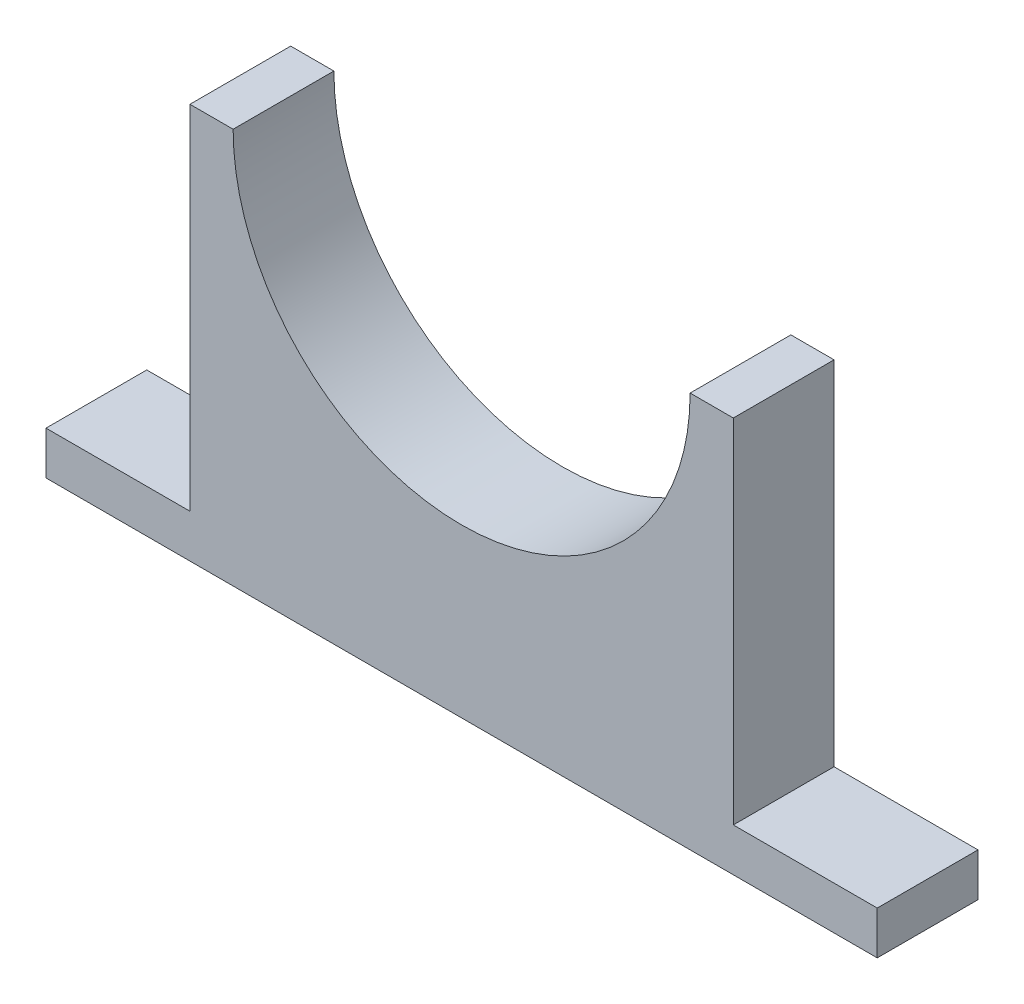
ISO-10303-21;
HEADER;
FILE_DESCRIPTION(('STEP AP214'),'2;1');
FILE_NAME('part.step','',(''),(''),'','','');
FILE_SCHEMA(('AUTOMOTIVE_DESIGN { 1 0 10303 214 1 1 1 1 }'));
ENDSEC;
DATA;
#1=APPLICATION_CONTEXT('core data for automotive mechanical design processes');
#2=APPLICATION_PROTOCOL_DEFINITION('international standard','automotive_design',2000,#1);
#3=PRODUCT_CONTEXT('',#1,'mechanical');
#4=PRODUCT('Part','Part','',(#3));
#5=PRODUCT_RELATED_PRODUCT_CATEGORY('part','',(#4));
#6=PRODUCT_DEFINITION_FORMATION('','',#4);
#7=PRODUCT_DEFINITION_CONTEXT('part definition',#1,'design');
#8=PRODUCT_DEFINITION('design','',#6,#7);
#9=PRODUCT_DEFINITION_SHAPE('','',#8);
#10=(LENGTH_UNIT() NAMED_UNIT(*) SI_UNIT(.MILLI.,.METRE.));
#11=(NAMED_UNIT(*) PLANE_ANGLE_UNIT() SI_UNIT($,.RADIAN.));
#12=(NAMED_UNIT(*) SI_UNIT($,.STERADIAN.) SOLID_ANGLE_UNIT());
#13=UNCERTAINTY_MEASURE_WITH_UNIT(LENGTH_MEASURE(1.E-05),#10,'distance_accuracy_value','');
#14=(GEOMETRIC_REPRESENTATION_CONTEXT(3) GLOBAL_UNCERTAINTY_ASSIGNED_CONTEXT((#13)) GLOBAL_UNIT_ASSIGNED_CONTEXT((#10,
#11,#12)) REPRESENTATION_CONTEXT('',''));
#15=CARTESIAN_POINT('',(0.,0.,0.));
#16=DIRECTION('',(0.,0.,1.));
#17=DIRECTION('',(1.,0.,0.));
#18=AXIS2_PLACEMENT_3D('',#15,#16,#17);
#19=CARTESIAN_POINT('',(0.,0.,7.));
#20=DIRECTION('',(0.,0.,-1.));
#21=DIRECTION('',(-1.,0.,0.));
#22=AXIS2_PLACEMENT_3D('',#19,#20,#21);
#23=CYLINDRICAL_SURFACE('',#22,15.875);
#24=CARTESIAN_POINT('',(0.,0.,0.));
#25=DIRECTION('',(0.,0.,-1.));
#26=DIRECTION('',(1.,0.,0.));
#27=AXIS2_PLACEMENT_3D('',#24,#25,#26);
#28=CIRCLE('',#27,15.875);
#29=CARTESIAN_POINT('',(15.875,0.,0.));
#30=VERTEX_POINT('',#29);
#31=CARTESIAN_POINT('',(-15.875,0.,0.));
#32=VERTEX_POINT('',#31);
#33=EDGE_CURVE('E141',#30,#32,#28,.T.);
#34=ORIENTED_EDGE('',*,*,#33,.T.);
#35=DIRECTION('',(0.,0.,-1.));
#36=VECTOR('',#35,1.);
#37=CARTESIAN_POINT('',(-15.875,0.,7.));
#38=LINE('',#37,#36);
#39=CARTESIAN_POINT('',(-15.875,0.,7.));
#40=VERTEX_POINT('',#39);
#41=EDGE_CURVE('E11',#40,#32,#38,.T.);
#42=ORIENTED_EDGE('',*,*,#41,.F.);
#43=CARTESIAN_POINT('',(0.,0.,7.));
#44=DIRECTION('',(0.,0.,-1.));
#45=DIRECTION('',(1.,0.,0.));
#46=AXIS2_PLACEMENT_3D('',#43,#44,#45);
#47=CIRCLE('',#46,15.875);
#48=CARTESIAN_POINT('',(15.875,0.,7.));
#49=VERTEX_POINT('',#48);
#50=EDGE_CURVE('E159',#49,#40,#47,.T.);
#51=ORIENTED_EDGE('',*,*,#50,.F.);
#52=DIRECTION('',(0.,0.,-1.));
#53=VECTOR('',#52,1.);
#54=CARTESIAN_POINT('',(15.875,0.,7.));
#55=LINE('',#54,#53);
#56=EDGE_CURVE('E137',#49,#30,#55,.T.);
#57=ORIENTED_EDGE('',*,*,#56,.T.);
#58=EDGE_LOOP('',(#34,#42,#51,#57));
#59=FACE_BOUND('',#58,.T.);
#60=ADVANCED_FACE('F33',(#59),#23,.F.);
#61=CARTESIAN_POINT('',(-15.875,0.,7.));
#62=DIRECTION('',(0.,-1.,0.));
#63=DIRECTION('',(1.,0.,0.));
#64=AXIS2_PLACEMENT_3D('',#61,#62,#63);
#65=PLANE('',#64);
#66=DIRECTION('',(-1.,0.,0.));
#67=VECTOR('',#66,1.);
#68=CARTESIAN_POINT('',(-15.875,0.,0.));
#69=LINE('',#68,#67);
#70=CARTESIAN_POINT('',(-18.875,0.,0.));
#71=VERTEX_POINT('',#70);
#72=EDGE_CURVE('E144',#32,#71,#69,.T.);
#73=ORIENTED_EDGE('',*,*,#72,.T.);
#74=DIRECTION('',(0.,0.,-1.));
#75=VECTOR('',#74,1.);
#76=CARTESIAN_POINT('',(-18.875,0.,7.));
#77=LINE('',#76,#75);
#78=CARTESIAN_POINT('',(-18.875,0.,7.));
#79=VERTEX_POINT('',#78);
#80=EDGE_CURVE('E41',#79,#71,#77,.T.);
#81=ORIENTED_EDGE('',*,*,#80,.F.);
#82=DIRECTION('',(-1.,0.,0.));
#83=VECTOR('',#82,1.);
#84=CARTESIAN_POINT('',(-15.875,0.,7.));
#85=LINE('',#84,#83);
#86=EDGE_CURVE('E98',#40,#79,#85,.T.);
#87=ORIENTED_EDGE('',*,*,#86,.F.);
#88=ORIENTED_EDGE('',*,*,#41,.T.);
#89=EDGE_LOOP('',(#73,#81,#87,#88));
#90=FACE_BOUND('',#89,.T.);
#91=ADVANCED_FACE('F208',(#90),#65,.F.);
#92=CARTESIAN_POINT('',(-18.875,0.,7.));
#93=DIRECTION('',(1.,0.,0.));
#94=DIRECTION('',(0.,1.,0.));
#95=AXIS2_PLACEMENT_3D('',#92,#93,#94);
#96=PLANE('',#95);
#97=DIRECTION('',(0.,-1.,0.));
#98=VECTOR('',#97,1.);
#99=CARTESIAN_POINT('',(-18.875,0.,0.));
#100=LINE('',#99,#98);
#101=CARTESIAN_POINT('',(-18.875,-24.485,0.));
#102=VERTEX_POINT('',#101);
#103=EDGE_CURVE('E146',#71,#102,#100,.T.);
#104=ORIENTED_EDGE('',*,*,#103,.T.);
#105=DIRECTION('',(0.,0.,-1.));
#106=VECTOR('',#105,1.);
#107=CARTESIAN_POINT('',(-18.875,-24.485,7.));
#108=LINE('',#107,#106);
#109=CARTESIAN_POINT('',(-18.875,-24.485,7.));
#110=VERTEX_POINT('',#109);
#111=EDGE_CURVE('E172',#110,#102,#108,.T.);
#112=ORIENTED_EDGE('',*,*,#111,.F.);
#113=DIRECTION('',(0.,-1.,0.));
#114=VECTOR('',#113,1.);
#115=CARTESIAN_POINT('',(-18.875,0.,7.));
#116=LINE('',#115,#114);
#117=EDGE_CURVE('E180',#79,#110,#116,.T.);
#118=ORIENTED_EDGE('',*,*,#117,.F.);
#119=ORIENTED_EDGE('',*,*,#80,.T.);
#120=EDGE_LOOP('',(#104,#112,#118,#119));
#121=FACE_BOUND('',#120,.T.);
#122=ADVANCED_FACE('F178',(#121),#96,.F.);
#123=CARTESIAN_POINT('',(-18.875,-24.485,7.));
#124=DIRECTION('',(0.,-1.,0.));
#125=DIRECTION('',(0.,0.,-1.));
#126=AXIS2_PLACEMENT_3D('',#123,#124,#125);
#127=PLANE('',#126);
#128=DIRECTION('',(-1.,0.,0.));
#129=VECTOR('',#128,1.);
#130=CARTESIAN_POINT('',(-18.875,-24.485,0.));
#131=LINE('',#130,#129);
#132=CARTESIAN_POINT('',(-28.875,-24.485,0.));
#133=VERTEX_POINT('',#132);
#134=EDGE_CURVE('E148',#102,#133,#131,.T.);
#135=ORIENTED_EDGE('',*,*,#134,.T.);
#136=DIRECTION('',(0.,0.,-1.));
#137=VECTOR('',#136,1.);
#138=CARTESIAN_POINT('',(-28.875,-24.485,7.));
#139=LINE('',#138,#137);
#140=CARTESIAN_POINT('',(-28.875,-24.485,7.));
#141=VERTEX_POINT('',#140);
#142=EDGE_CURVE('E169',#141,#133,#139,.T.);
#143=ORIENTED_EDGE('',*,*,#142,.F.);
#144=DIRECTION('',(-1.,0.,0.));
#145=VECTOR('',#144,1.);
#146=CARTESIAN_POINT('',(-18.875,-24.485,7.));
#147=LINE('',#146,#145);
#148=EDGE_CURVE('E198',#110,#141,#147,.T.);
#149=ORIENTED_EDGE('',*,*,#148,.F.);
#150=ORIENTED_EDGE('',*,*,#111,.T.);
#151=EDGE_LOOP('',(#135,#143,#149,#150));
#152=FACE_BOUND('',#151,.T.);
#153=ADVANCED_FACE('F189',(#152),#127,.F.);
#154=CARTESIAN_POINT('',(-28.875,-24.485,7.));
#155=DIRECTION('',(1.,0.,0.));
#156=DIRECTION('',(0.,0.,-1.));
#157=AXIS2_PLACEMENT_3D('',#154,#155,#156);
#158=PLANE('',#157);
#159=DIRECTION('',(0.,-1.,0.));
#160=VECTOR('',#159,1.);
#161=CARTESIAN_POINT('',(-28.875,-24.485,0.));
#162=LINE('',#161,#160);
#163=CARTESIAN_POINT('',(-28.875,-27.485,0.));
#164=VERTEX_POINT('',#163);
#165=EDGE_CURVE('E150',#133,#164,#162,.T.);
#166=ORIENTED_EDGE('',*,*,#165,.T.);
#167=DIRECTION('',(0.,0.,-1.));
#168=VECTOR('',#167,1.);
#169=CARTESIAN_POINT('',(-28.875,-27.485,7.));
#170=LINE('',#169,#168);
#171=CARTESIAN_POINT('',(-28.875,-27.485,7.));
#172=VERTEX_POINT('',#171);
#173=EDGE_CURVE('E166',#172,#164,#170,.T.);
#174=ORIENTED_EDGE('',*,*,#173,.F.);
#175=DIRECTION('',(0.,-1.,0.));
#176=VECTOR('',#175,1.);
#177=CARTESIAN_POINT('',(-28.875,-24.485,7.));
#178=LINE('',#177,#176);
#179=EDGE_CURVE('E195',#141,#172,#178,.T.);
#180=ORIENTED_EDGE('',*,*,#179,.F.);
#181=ORIENTED_EDGE('',*,*,#142,.T.);
#182=EDGE_LOOP('',(#166,#174,#180,#181));
#183=FACE_BOUND('',#182,.T.);
#184=ADVANCED_FACE('F193',(#183),#158,.F.);
#185=CARTESIAN_POINT('',(-28.875,-27.485,7.));
#186=DIRECTION('',(0.,1.,0.));
#187=DIRECTION('',(0.,0.,1.));
#188=AXIS2_PLACEMENT_3D('',#185,#186,#187);
#189=PLANE('',#188);
#190=DIRECTION('',(1.,0.,0.));
#191=VECTOR('',#190,1.);
#192=CARTESIAN_POINT('',(-28.875,-27.485,0.));
#193=LINE('',#192,#191);
#194=CARTESIAN_POINT('',(28.875,-27.485,0.));
#195=VERTEX_POINT('',#194);
#196=EDGE_CURVE('E152',#164,#195,#193,.T.);
#197=ORIENTED_EDGE('',*,*,#196,.T.);
#198=DIRECTION('',(0.,0.,-1.));
#199=VECTOR('',#198,1.);
#200=CARTESIAN_POINT('',(28.875,-27.485,7.));
#201=LINE('',#200,#199);
#202=CARTESIAN_POINT('',(28.875,-27.485,7.));
#203=VERTEX_POINT('',#202);
#204=EDGE_CURVE('E163',#203,#195,#201,.T.);
#205=ORIENTED_EDGE('',*,*,#204,.F.);
#206=DIRECTION('',(1.,0.,0.));
#207=VECTOR('',#206,1.);
#208=CARTESIAN_POINT('',(-28.875,-27.485,7.));
#209=LINE('',#208,#207);
#210=EDGE_CURVE('E197',#172,#203,#209,.T.);
#211=ORIENTED_EDGE('',*,*,#210,.F.);
#212=ORIENTED_EDGE('',*,*,#173,.T.);
#213=EDGE_LOOP('',(#197,#205,#211,#212));
#214=FACE_BOUND('',#213,.T.);
#215=ADVANCED_FACE('F220',(#214),#189,.F.);
#216=CARTESIAN_POINT('',(28.875,-27.485,7.));
#217=DIRECTION('',(-1.,0.,0.));
#218=DIRECTION('',(0.,0.,1.));
#219=AXIS2_PLACEMENT_3D('',#216,#217,#218);
#220=PLANE('',#219);
#221=DIRECTION('',(0.,1.,0.));
#222=VECTOR('',#221,1.);
#223=CARTESIAN_POINT('',(28.875,-27.485,0.));
#224=LINE('',#223,#222);
#225=CARTESIAN_POINT('',(28.875,-24.485,0.));
#226=VERTEX_POINT('',#225);
#227=EDGE_CURVE('E154',#195,#226,#224,.T.);
#228=ORIENTED_EDGE('',*,*,#227,.T.);
#229=DIRECTION('',(0.,0.,-1.));
#230=VECTOR('',#229,1.);
#231=CARTESIAN_POINT('',(28.875,-24.485,7.));
#232=LINE('',#231,#230);
#233=CARTESIAN_POINT('',(28.875,-24.485,7.));
#234=VERTEX_POINT('',#233);
#235=EDGE_CURVE('E132',#234,#226,#232,.T.);
#236=ORIENTED_EDGE('',*,*,#235,.F.);
#237=DIRECTION('',(0.,1.,0.));
#238=VECTOR('',#237,1.);
#239=CARTESIAN_POINT('',(28.875,-27.485,7.));
#240=LINE('',#239,#238);
#241=EDGE_CURVE('E123',#203,#234,#240,.T.);
#242=ORIENTED_EDGE('',*,*,#241,.F.);
#243=ORIENTED_EDGE('',*,*,#204,.T.);
#244=EDGE_LOOP('',(#228,#236,#242,#243));
#245=FACE_BOUND('',#244,.T.);
#246=ADVANCED_FACE('F223',(#245),#220,.F.);
#247=CARTESIAN_POINT('',(28.875,-24.485,7.));
#248=DIRECTION('',(0.,-1.,0.));
#249=DIRECTION('',(0.,0.,-1.));
#250=AXIS2_PLACEMENT_3D('',#247,#248,#249);
#251=PLANE('',#250);
#252=DIRECTION('',(-1.,0.,0.));
#253=VECTOR('',#252,1.);
#254=CARTESIAN_POINT('',(28.875,-24.485,0.));
#255=LINE('',#254,#253);
#256=CARTESIAN_POINT('',(18.875,-24.485,0.));
#257=VERTEX_POINT('',#256);
#258=EDGE_CURVE('E131',#226,#257,#255,.T.);
#259=ORIENTED_EDGE('',*,*,#258,.T.);
#260=DIRECTION('',(0.,0.,-1.));
#261=VECTOR('',#260,1.);
#262=CARTESIAN_POINT('',(18.875,-24.485,7.));
#263=LINE('',#262,#261);
#264=CARTESIAN_POINT('',(18.875,-24.485,7.));
#265=VERTEX_POINT('',#264);
#266=EDGE_CURVE('E128',#265,#257,#263,.T.);
#267=ORIENTED_EDGE('',*,*,#266,.F.);
#268=DIRECTION('',(-1.,0.,0.));
#269=VECTOR('',#268,1.);
#270=CARTESIAN_POINT('',(28.875,-24.485,7.));
#271=LINE('',#270,#269);
#272=EDGE_CURVE('E117',#234,#265,#271,.T.);
#273=ORIENTED_EDGE('',*,*,#272,.F.);
#274=ORIENTED_EDGE('',*,*,#235,.T.);
#275=EDGE_LOOP('',(#259,#267,#273,#274));
#276=FACE_BOUND('',#275,.T.);
#277=ADVANCED_FACE('F129',(#276),#251,.F.);
#278=CARTESIAN_POINT('',(18.875,-24.485,7.));
#279=DIRECTION('',(-1.,0.,0.));
#280=DIRECTION('',(0.,-1.,0.));
#281=AXIS2_PLACEMENT_3D('',#278,#279,#280);
#282=PLANE('',#281);
#283=DIRECTION('',(0.,1.,0.));
#284=VECTOR('',#283,1.);
#285=CARTESIAN_POINT('',(18.875,-24.485,0.));
#286=LINE('',#285,#284);
#287=CARTESIAN_POINT('',(18.875,0.,0.));
#288=VERTEX_POINT('',#287);
#289=EDGE_CURVE('E84',#257,#288,#286,.T.);
#290=ORIENTED_EDGE('',*,*,#289,.T.);
#291=DIRECTION('',(0.,0.,-1.));
#292=VECTOR('',#291,1.);
#293=CARTESIAN_POINT('',(18.875,0.,7.));
#294=LINE('',#293,#292);
#295=CARTESIAN_POINT('',(18.875,0.,7.));
#296=VERTEX_POINT('',#295);
#297=EDGE_CURVE('E133',#296,#288,#294,.T.);
#298=ORIENTED_EDGE('',*,*,#297,.F.);
#299=DIRECTION('',(0.,1.,0.));
#300=VECTOR('',#299,1.);
#301=CARTESIAN_POINT('',(18.875,-24.485,7.));
#302=LINE('',#301,#300);
#303=EDGE_CURVE('E121',#265,#296,#302,.T.);
#304=ORIENTED_EDGE('',*,*,#303,.F.);
#305=ORIENTED_EDGE('',*,*,#266,.T.);
#306=EDGE_LOOP('',(#290,#298,#304,#305));
#307=FACE_BOUND('',#306,.T.);
#308=ADVANCED_FACE('F135',(#307),#282,.F.);
#309=CARTESIAN_POINT('',(18.875,0.,7.));
#310=DIRECTION('',(0.,-1.,0.));
#311=DIRECTION('',(1.,0.,0.));
#312=AXIS2_PLACEMENT_3D('',#309,#310,#311);
#313=PLANE('',#312);
#314=DIRECTION('',(-1.,0.,0.));
#315=VECTOR('',#314,1.);
#316=CARTESIAN_POINT('',(18.875,0.,0.));
#317=LINE('',#316,#315);
#318=EDGE_CURVE('E90',#288,#30,#317,.T.);
#319=ORIENTED_EDGE('',*,*,#318,.T.);
#320=ORIENTED_EDGE('',*,*,#56,.F.);
#321=DIRECTION('',(-1.,0.,0.));
#322=VECTOR('',#321,1.);
#323=CARTESIAN_POINT('',(18.875,0.,7.));
#324=LINE('',#323,#322);
#325=EDGE_CURVE('E49',#296,#49,#324,.T.);
#326=ORIENTED_EDGE('',*,*,#325,.F.);
#327=ORIENTED_EDGE('',*,*,#297,.T.);
#328=EDGE_LOOP('',(#319,#320,#326,#327));
#329=FACE_BOUND('',#328,.T.);
#330=ADVANCED_FACE('F232',(#329),#313,.F.);
#331=CARTESIAN_POINT('',(0.,0.,7.));
#332=DIRECTION('',(0.,0.,1.));
#333=DIRECTION('',(1.,0.,0.));
#334=AXIS2_PLACEMENT_3D('',#331,#332,#333);
#335=PLANE('',#334);
#336=ORIENTED_EDGE('',*,*,#50,.T.);
#337=ORIENTED_EDGE('',*,*,#86,.T.);
#338=ORIENTED_EDGE('',*,*,#117,.T.);
#339=ORIENTED_EDGE('',*,*,#148,.T.);
#340=ORIENTED_EDGE('',*,*,#179,.T.);
#341=ORIENTED_EDGE('',*,*,#210,.T.);
#342=ORIENTED_EDGE('',*,*,#241,.T.);
#343=ORIENTED_EDGE('',*,*,#272,.T.);
#344=ORIENTED_EDGE('',*,*,#303,.T.);
#345=ORIENTED_EDGE('',*,*,#325,.T.);
#346=EDGE_LOOP('',(#336,#337,#338,#339,#340,#341,#342,#343,#344,#345));
#347=FACE_BOUND('',#346,.T.);
#348=ADVANCED_FACE('F119',(#347),#335,.T.);
#349=CARTESIAN_POINT('',(0.,0.,0.));
#350=DIRECTION('',(0.,0.,1.));
#351=DIRECTION('',(1.,0.,0.));
#352=AXIS2_PLACEMENT_3D('',#349,#350,#351);
#353=PLANE('',#352);
#354=ORIENTED_EDGE('',*,*,#33,.F.);
#355=ORIENTED_EDGE('',*,*,#318,.F.);
#356=ORIENTED_EDGE('',*,*,#289,.F.);
#357=ORIENTED_EDGE('',*,*,#258,.F.);
#358=ORIENTED_EDGE('',*,*,#227,.F.);
#359=ORIENTED_EDGE('',*,*,#196,.F.);
#360=ORIENTED_EDGE('',*,*,#165,.F.);
#361=ORIENTED_EDGE('',*,*,#134,.F.);
#362=ORIENTED_EDGE('',*,*,#103,.F.);
#363=ORIENTED_EDGE('',*,*,#72,.F.);
#364=EDGE_LOOP('',(#354,#355,#356,#357,#358,#359,#360,#361,#362,#363));
#365=FACE_BOUND('',#364,.T.);
#366=ADVANCED_FACE('F184',(#365),#353,.F.);
#367=CLOSED_SHELL('',(#60,#91,#122,#153,#184,#215,#246,#277,#308,#330,#348,#366));
#368=MANIFOLD_SOLID_BREP('B2',#367);
#369=ADVANCED_BREP_SHAPE_REPRESENTATION('',(#18,#368),#14);
#370=SHAPE_DEFINITION_REPRESENTATION(#9,#369);
ENDSEC;
END-ISO-10303-21;
